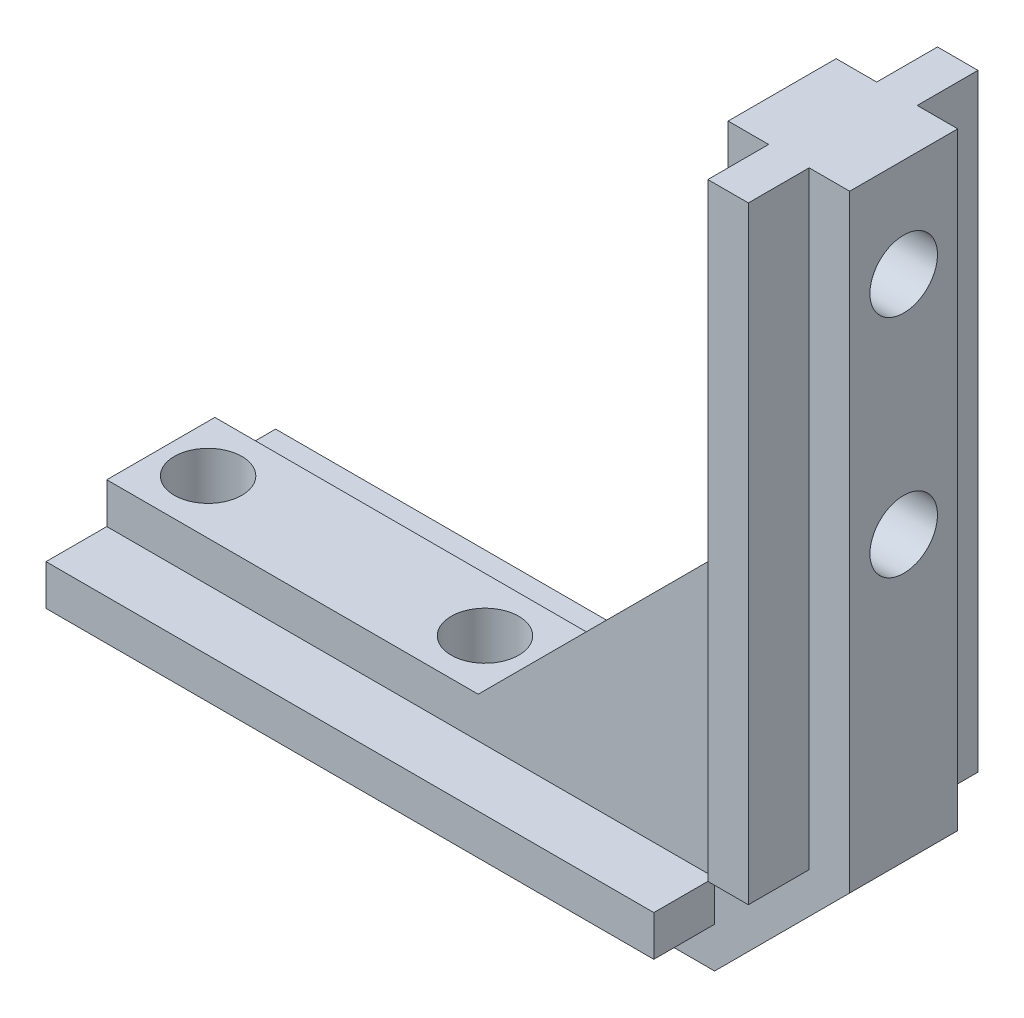
ISO-10303-21;
HEADER;
FILE_DESCRIPTION(('STEP AP214'),'2;1');
FILE_NAME('part.step','',(''),(''),'','','');
FILE_SCHEMA(('AUTOMOTIVE_DESIGN { 1 0 10303 214 1 1 1 1 }'));
ENDSEC;
DATA;
#1=APPLICATION_CONTEXT('core data for automotive mechanical design processes');
#2=APPLICATION_PROTOCOL_DEFINITION('international standard','automotive_design',2000,#1);
#3=PRODUCT_CONTEXT('',#1,'mechanical');
#4=PRODUCT('Part','Part','',(#3));
#5=PRODUCT_RELATED_PRODUCT_CATEGORY('part','',(#4));
#6=PRODUCT_DEFINITION_FORMATION('','',#4);
#7=PRODUCT_DEFINITION_CONTEXT('part definition',#1,'design');
#8=PRODUCT_DEFINITION('design','',#6,#7);
#9=PRODUCT_DEFINITION_SHAPE('','',#8);
#10=(LENGTH_UNIT() NAMED_UNIT(*) SI_UNIT(.MILLI.,.METRE.));
#11=(NAMED_UNIT(*) PLANE_ANGLE_UNIT() SI_UNIT($,.RADIAN.));
#12=(NAMED_UNIT(*) SI_UNIT($,.STERADIAN.) SOLID_ANGLE_UNIT());
#13=UNCERTAINTY_MEASURE_WITH_UNIT(LENGTH_MEASURE(1.E-05),#10,'distance_accuracy_value','');
#14=(GEOMETRIC_REPRESENTATION_CONTEXT(3) GLOBAL_UNCERTAINTY_ASSIGNED_CONTEXT((#13)) GLOBAL_UNIT_ASSIGNED_CONTEXT((#10,
#11,#12)) REPRESENTATION_CONTEXT('',''));
#15=CARTESIAN_POINT('',(0.,0.,0.));
#16=DIRECTION('',(0.,0.,1.));
#17=DIRECTION('',(1.,0.,0.));
#18=AXIS2_PLACEMENT_3D('',#15,#16,#17);
#19=CARTESIAN_POINT('',(46.,55.,4.));
#20=DIRECTION('',(1.,0.,0.));
#21=DIRECTION('',(0.,1.,0.));
#22=AXIS2_PLACEMENT_3D('',#19,#20,#21);
#23=PLANE('',#22);
#24=CARTESIAN_POINT('',(46.,31.,0.));
#25=DIRECTION('',(-1.,0.,0.));
#26=DIRECTION('',(0.,0.,1.));
#27=AXIS2_PLACEMENT_3D('',#24,#25,#26);
#28=CIRCLE('',#27,2.49999999999999);
#29=CARTESIAN_POINT('',(46.,31.,2.49999999999999));
#30=VERTEX_POINT('',#29);
#31=EDGE_CURVE('E778',#30,#30,#28,.T.);
#32=ORIENTED_EDGE('',*,*,#31,.F.);
#33=EDGE_LOOP('',(#32));
#34=FACE_BOUND('',#33,.T.);
#35=DIRECTION('',(0.,-1.,0.));
#36=VECTOR('',#35,1.);
#37=CARTESIAN_POINT('',(46.,55.,-4.));
#38=LINE('',#37,#36);
#39=CARTESIAN_POINT('',(46.,55.,-4.));
#40=VERTEX_POINT('',#39);
#41=CARTESIAN_POINT('',(46.,27.5,-4.));
#42=VERTEX_POINT('',#41);
#43=EDGE_CURVE('E421',#40,#42,#38,.T.);
#44=ORIENTED_EDGE('',*,*,#43,.T.);
#45=DIRECTION('',(0.,0.,-1.));
#46=VECTOR('',#45,1.);
#47=CARTESIAN_POINT('',(46.,27.5,4.));
#48=LINE('',#47,#46);
#49=CARTESIAN_POINT('',(46.,27.5,4.));
#50=VERTEX_POINT('',#49);
#51=EDGE_CURVE('E436',#50,#42,#48,.T.);
#52=ORIENTED_EDGE('',*,*,#51,.F.);
#53=DIRECTION('',(0.,-1.,0.));
#54=VECTOR('',#53,1.);
#55=CARTESIAN_POINT('',(46.,55.,4.));
#56=LINE('',#55,#54);
#57=CARTESIAN_POINT('',(46.,55.,4.));
#58=VERTEX_POINT('',#57);
#59=EDGE_CURVE('E395',#58,#50,#56,.T.);
#60=ORIENTED_EDGE('',*,*,#59,.F.);
#61=DIRECTION('',(0.,0.,-1.));
#62=VECTOR('',#61,1.);
#63=CARTESIAN_POINT('',(46.,55.,4.));
#64=LINE('',#63,#62);
#65=EDGE_CURVE('E440',#58,#40,#64,.T.);
#66=ORIENTED_EDGE('',*,*,#65,.T.);
#67=EDGE_LOOP('',(#44,#52,#60,#66));
#68=FACE_BOUND('',#67,.T.);
#69=CARTESIAN_POINT('',(46.,47.69,0.));
#70=DIRECTION('',(-1.,0.,0.));
#71=DIRECTION('',(0.,0.,1.));
#72=AXIS2_PLACEMENT_3D('',#69,#70,#71);
#73=CIRCLE('',#72,2.49999999999999);
#74=CARTESIAN_POINT('',(46.,47.69,2.49999999999999));
#75=VERTEX_POINT('',#74);
#76=EDGE_CURVE('E771',#75,#75,#73,.T.);
#77=ORIENTED_EDGE('',*,*,#76,.F.);
#78=EDGE_LOOP('',(#77));
#79=FACE_BOUND('',#78,.T.);
#80=ADVANCED_FACE('F44',(#34,#68,#79),#23,.F.);
#81=CARTESIAN_POINT('',(0.,9.,4.));
#82=DIRECTION('',(1.,0.,0.));
#83=DIRECTION('',(0.,1.,0.));
#84=AXIS2_PLACEMENT_3D('',#81,#82,#83);
#85=PLANE('',#84);
#86=DIRECTION('',(0.,-1.,0.));
#87=VECTOR('',#86,1.);
#88=CARTESIAN_POINT('',(0.,9.,-4.));
#89=LINE('',#88,#87);
#90=CARTESIAN_POINT('',(0.,9.,-4.));
#91=VERTEX_POINT('',#90);
#92=CARTESIAN_POINT('',(0.,6.,-4.));
#93=VERTEX_POINT('',#92);
#94=EDGE_CURVE('E212',#91,#93,#89,.T.);
#95=ORIENTED_EDGE('',*,*,#94,.T.);
#96=DIRECTION('',(0.,0.,1.));
#97=VECTOR('',#96,1.);
#98=CARTESIAN_POINT('',(0.,6.,-8.5));
#99=LINE('',#98,#97);
#100=CARTESIAN_POINT('',(0.,6.,-8.5));
#101=VERTEX_POINT('',#100);
#102=EDGE_CURVE('E207',#101,#93,#99,.T.);
#103=ORIENTED_EDGE('',*,*,#102,.F.);
#104=DIRECTION('',(0.,-1.,0.));
#105=VECTOR('',#104,1.);
#106=CARTESIAN_POINT('',(0.,0.,-8.5));
#107=LINE('',#106,#105);
#108=CARTESIAN_POINT('',(0.,3.,-8.5));
#109=VERTEX_POINT('',#108);
#110=EDGE_CURVE('E209',#101,#109,#107,.T.);
#111=ORIENTED_EDGE('',*,*,#110,.T.);
#112=DIRECTION('',(0.,0.,1.));
#113=VECTOR('',#112,1.);
#114=CARTESIAN_POINT('',(0.,3.,-8.5));
#115=LINE('',#114,#113);
#116=CARTESIAN_POINT('',(0.,3.,-4.));
#117=VERTEX_POINT('',#116);
#118=EDGE_CURVE('E215',#109,#117,#115,.T.);
#119=ORIENTED_EDGE('',*,*,#118,.T.);
#120=CARTESIAN_POINT('',(0.,0.,-4.));
#121=VERTEX_POINT('',#120);
#122=EDGE_CURVE('E338',#117,#121,#89,.T.);
#123=ORIENTED_EDGE('',*,*,#122,.T.);
#124=DIRECTION('',(0.,0.,-1.));
#125=VECTOR('',#124,1.);
#126=CARTESIAN_POINT('',(0.,0.,4.));
#127=LINE('',#126,#125);
#128=CARTESIAN_POINT('',(0.,0.,4.));
#129=VERTEX_POINT('',#128);
#130=EDGE_CURVE('E11',#129,#121,#127,.T.);
#131=ORIENTED_EDGE('',*,*,#130,.F.);
#132=DIRECTION('',(0.,-1.,0.));
#133=VECTOR('',#132,1.);
#134=CARTESIAN_POINT('',(0.,9.,4.));
#135=LINE('',#134,#133);
#136=CARTESIAN_POINT('',(0.,3.,4.));
#137=VERTEX_POINT('',#136);
#138=EDGE_CURVE('E382',#137,#129,#135,.T.);
#139=ORIENTED_EDGE('',*,*,#138,.F.);
#140=DIRECTION('',(0.,0.,-1.));
#141=VECTOR('',#140,1.);
#142=CARTESIAN_POINT('',(0.,3.,8.5));
#143=LINE('',#142,#141);
#144=CARTESIAN_POINT('',(0.,3.,8.5));
#145=VERTEX_POINT('',#144);
#146=EDGE_CURVE('E334',#145,#137,#143,.T.);
#147=ORIENTED_EDGE('',*,*,#146,.F.);
#148=DIRECTION('',(0.,-1.,0.));
#149=VECTOR('',#148,1.);
#150=CARTESIAN_POINT('',(0.,6.,8.5));
#151=LINE('',#150,#149);
#152=CARTESIAN_POINT('',(0.,6.,8.5));
#153=VERTEX_POINT('',#152);
#154=EDGE_CURVE('E296',#153,#145,#151,.T.);
#155=ORIENTED_EDGE('',*,*,#154,.F.);
#156=DIRECTION('',(0.,0.,-1.));
#157=VECTOR('',#156,1.);
#158=CARTESIAN_POINT('',(0.,6.,8.5));
#159=LINE('',#158,#157);
#160=CARTESIAN_POINT('',(0.,6.,4.));
#161=VERTEX_POINT('',#160);
#162=EDGE_CURVE('E310',#153,#161,#159,.T.);
#163=ORIENTED_EDGE('',*,*,#162,.T.);
#164=CARTESIAN_POINT('',(0.,9.,4.));
#165=VERTEX_POINT('',#164);
#166=EDGE_CURVE('E378',#165,#161,#135,.T.);
#167=ORIENTED_EDGE('',*,*,#166,.F.);
#168=DIRECTION('',(0.,0.,-1.));
#169=VECTOR('',#168,1.);
#170=CARTESIAN_POINT('',(0.,9.,4.));
#171=LINE('',#170,#169);
#172=EDGE_CURVE('E404',#165,#91,#171,.T.);
#173=ORIENTED_EDGE('',*,*,#172,.T.);
#174=EDGE_LOOP('',(#95,#103,#111,#119,#123,#131,#139,#147,#155,#163,#167,#173));
#175=FACE_BOUND('',#174,.T.);
#176=ADVANCED_FACE('F46',(#175),#85,.F.);
#177=CARTESIAN_POINT('',(0.,0.,4.));
#178=DIRECTION('',(0.,1.,0.));
#179=DIRECTION('',(0.,0.,1.));
#180=AXIS2_PLACEMENT_3D('',#177,#178,#179);
#181=PLANE('',#180);
#182=CARTESIAN_POINT('',(3.5,0.,0.));
#183=DIRECTION('',(0.,1.,0.));
#184=DIRECTION('',(0.,0.,1.));
#185=AXIS2_PLACEMENT_3D('',#182,#183,#184);
#186=CIRCLE('',#185,2.5);
#187=CARTESIAN_POINT('',(3.5,0.,2.5));
#188=VERTEX_POINT('',#187);
#189=EDGE_CURVE('E536',#188,#188,#186,.T.);
#190=ORIENTED_EDGE('',*,*,#189,.T.);
#191=EDGE_LOOP('',(#190));
#192=FACE_BOUND('',#191,.T.);
#193=CARTESIAN_POINT('',(24.0000000000001,0.,0.));
#194=DIRECTION('',(0.,1.,0.));
#195=DIRECTION('',(0.,0.,1.));
#196=AXIS2_PLACEMENT_3D('',#193,#194,#195);
#197=CIRCLE('',#196,2.5);
#198=CARTESIAN_POINT('',(24.0000000000001,0.,2.5));
#199=VERTEX_POINT('',#198);
#200=EDGE_CURVE('E539',#199,#199,#197,.T.);
#201=ORIENTED_EDGE('',*,*,#200,.T.);
#202=EDGE_LOOP('',(#201));
#203=FACE_BOUND('',#202,.T.);
#204=DIRECTION('',(1.,0.,0.));
#205=VECTOR('',#204,1.);
#206=CARTESIAN_POINT('',(0.,0.,-4.));
#207=LINE('',#206,#205);
#208=CARTESIAN_POINT('',(45.0000000000002,0.,-4.));
#209=VERTEX_POINT('',#208);
#210=EDGE_CURVE('E407',#121,#209,#207,.T.);
#211=ORIENTED_EDGE('',*,*,#210,.T.);
#212=DIRECTION('',(0.,0.,-1.));
#213=VECTOR('',#212,1.);
#214=CARTESIAN_POINT('',(45.0000000000002,0.,4.));
#215=LINE('',#214,#213);
#216=CARTESIAN_POINT('',(45.0000000000002,0.,4.));
#217=VERTEX_POINT('',#216);
#218=EDGE_CURVE('E53',#217,#209,#215,.T.);
#219=ORIENTED_EDGE('',*,*,#218,.F.);
#220=DIRECTION('',(1.,0.,0.));
#221=VECTOR('',#220,1.);
#222=CARTESIAN_POINT('',(0.,0.,4.));
#223=LINE('',#222,#221);
#224=EDGE_CURVE('E381',#129,#217,#223,.T.);
#225=ORIENTED_EDGE('',*,*,#224,.F.);
#226=ORIENTED_EDGE('',*,*,#130,.T.);
#227=EDGE_LOOP('',(#211,#219,#225,#226));
#228=FACE_BOUND('',#227,.T.);
#229=ADVANCED_FACE('F515',(#192,#203,#228),#181,.F.);
#230=CARTESIAN_POINT('',(55.,10.,4.));
#231=DIRECTION('',(-0.707106781186554,0.707106781186541,0.));
#232=DIRECTION('',(-0.707106781186541,-0.707106781186554,0.));
#233=AXIS2_PLACEMENT_3D('',#230,#231,#232);
#234=PLANE('',#233);
#235=DIRECTION('',(0.707106781186541,0.707106781186554,0.));
#236=VECTOR('',#235,1.);
#237=CARTESIAN_POINT('',(55.,10.,-4.));
#238=LINE('',#237,#236);
#239=CARTESIAN_POINT('',(55.,10.,-4.));
#240=VERTEX_POINT('',#239);
#241=EDGE_CURVE('E410',#209,#240,#238,.T.);
#242=ORIENTED_EDGE('',*,*,#241,.T.);
#243=DIRECTION('',(0.,0.,-1.));
#244=VECTOR('',#243,1.);
#245=CARTESIAN_POINT('',(55.,10.,4.));
#246=LINE('',#245,#244);
#247=CARTESIAN_POINT('',(55.,10.,4.));
#248=VERTEX_POINT('',#247);
#249=EDGE_CURVE('E448',#248,#240,#246,.T.);
#250=ORIENTED_EDGE('',*,*,#249,.F.);
#251=DIRECTION('',(0.707106781186541,0.707106781186554,0.));
#252=VECTOR('',#251,1.);
#253=CARTESIAN_POINT('',(55.,10.,4.));
#254=LINE('',#253,#252);
#255=EDGE_CURVE('E385',#217,#248,#254,.T.);
#256=ORIENTED_EDGE('',*,*,#255,.F.);
#257=ORIENTED_EDGE('',*,*,#218,.T.);
#258=EDGE_LOOP('',(#242,#250,#256,#257));
#259=FACE_BOUND('',#258,.T.);
#260=ADVANCED_FACE('F457',(#259),#234,.F.);
#261=CARTESIAN_POINT('',(55.,10.,4.));
#262=DIRECTION('',(-1.,0.,0.));
#263=DIRECTION('',(0.,-1.,0.));
#264=AXIS2_PLACEMENT_3D('',#261,#262,#263);
#265=PLANE('',#264);
#266=CARTESIAN_POINT('',(55.,47.69,0.));
#267=DIRECTION('',(-1.,0.,0.));
#268=DIRECTION('',(0.,0.,1.));
#269=AXIS2_PLACEMENT_3D('',#266,#267,#268);
#270=CIRCLE('',#269,2.5);
#271=CARTESIAN_POINT('',(55.,47.69,2.5));
#272=VERTEX_POINT('',#271);
#273=EDGE_CURVE('E775',#272,#272,#270,.T.);
#274=ORIENTED_EDGE('',*,*,#273,.T.);
#275=EDGE_LOOP('',(#274));
#276=FACE_BOUND('',#275,.T.);
#277=CARTESIAN_POINT('',(55.,31.,0.));
#278=DIRECTION('',(-1.,0.,0.));
#279=DIRECTION('',(0.,0.,1.));
#280=AXIS2_PLACEMENT_3D('',#277,#278,#279);
#281=CIRCLE('',#280,2.5);
#282=CARTESIAN_POINT('',(55.,31.,2.5));
#283=VERTEX_POINT('',#282);
#284=EDGE_CURVE('E239',#283,#283,#281,.T.);
#285=ORIENTED_EDGE('',*,*,#284,.T.);
#286=EDGE_LOOP('',(#285));
#287=FACE_BOUND('',#286,.T.);
#288=DIRECTION('',(0.,1.,0.));
#289=VECTOR('',#288,1.);
#290=CARTESIAN_POINT('',(55.,10.,-4.));
#291=LINE('',#290,#289);
#292=CARTESIAN_POINT('',(55.,55.,-4.));
#293=VERTEX_POINT('',#292);
#294=EDGE_CURVE('E413',#240,#293,#291,.T.);
#295=ORIENTED_EDGE('',*,*,#294,.T.);
#296=DIRECTION('',(0.,0.,-1.));
#297=VECTOR('',#296,1.);
#298=CARTESIAN_POINT('',(55.,55.,4.));
#299=LINE('',#298,#297);
#300=CARTESIAN_POINT('',(55.,55.,4.));
#301=VERTEX_POINT('',#300);
#302=EDGE_CURVE('E444',#301,#293,#299,.T.);
#303=ORIENTED_EDGE('',*,*,#302,.F.);
#304=DIRECTION('',(0.,1.,0.));
#305=VECTOR('',#304,1.);
#306=CARTESIAN_POINT('',(55.,10.,4.));
#307=LINE('',#306,#305);
#308=EDGE_CURVE('E388',#248,#301,#307,.T.);
#309=ORIENTED_EDGE('',*,*,#308,.F.);
#310=ORIENTED_EDGE('',*,*,#249,.T.);
#311=EDGE_LOOP('',(#295,#303,#309,#310));
#312=FACE_BOUND('',#311,.T.);
#313=ADVANCED_FACE('F469',(#276,#287,#312),#265,.F.);
#314=CARTESIAN_POINT('',(55.,55.,4.));
#315=DIRECTION('',(0.,-1.,0.));
#316=DIRECTION('',(0.,0.,-1.));
#317=AXIS2_PLACEMENT_3D('',#314,#315,#316);
#318=PLANE('',#317);
#319=DIRECTION('',(-1.,0.,0.));
#320=VECTOR('',#319,1.);
#321=CARTESIAN_POINT('',(55.,55.,-4.));
#322=LINE('',#321,#320);
#323=CARTESIAN_POINT('',(52.,55.,-4.));
#324=VERTEX_POINT('',#323);
#325=EDGE_CURVE('E417',#293,#324,#322,.T.);
#326=ORIENTED_EDGE('',*,*,#325,.T.);
#327=DIRECTION('',(0.,0.,1.));
#328=VECTOR('',#327,1.);
#329=CARTESIAN_POINT('',(52.,55.,-8.5));
#330=LINE('',#329,#328);
#331=CARTESIAN_POINT('',(52.,55.,-8.5));
#332=VERTEX_POINT('',#331);
#333=EDGE_CURVE('E68',#332,#324,#330,.T.);
#334=ORIENTED_EDGE('',*,*,#333,.F.);
#335=DIRECTION('',(-1.,0.,0.));
#336=VECTOR('',#335,1.);
#337=CARTESIAN_POINT('',(0.,55.,-8.5));
#338=LINE('',#337,#336);
#339=CARTESIAN_POINT('',(49.,55.,-8.5));
#340=VERTEX_POINT('',#339);
#341=EDGE_CURVE('E272',#332,#340,#338,.T.);
#342=ORIENTED_EDGE('',*,*,#341,.T.);
#343=DIRECTION('',(0.,0.,1.));
#344=VECTOR('',#343,1.);
#345=CARTESIAN_POINT('',(49.,55.,-8.5));
#346=LINE('',#345,#344);
#347=CARTESIAN_POINT('',(49.,55.,-4.));
#348=VERTEX_POINT('',#347);
#349=EDGE_CURVE('E248',#340,#348,#346,.T.);
#350=ORIENTED_EDGE('',*,*,#349,.T.);
#351=EDGE_CURVE('E416',#348,#40,#322,.T.);
#352=ORIENTED_EDGE('',*,*,#351,.T.);
#353=ORIENTED_EDGE('',*,*,#65,.F.);
#354=DIRECTION('',(-1.,0.,0.));
#355=VECTOR('',#354,1.);
#356=CARTESIAN_POINT('',(55.,55.,4.));
#357=LINE('',#356,#355);
#358=CARTESIAN_POINT('',(49.,55.,4.));
#359=VERTEX_POINT('',#358);
#360=EDGE_CURVE('E391',#359,#58,#357,.T.);
#361=ORIENTED_EDGE('',*,*,#360,.F.);
#362=DIRECTION('',(0.,0.,-1.));
#363=VECTOR('',#362,1.);
#364=CARTESIAN_POINT('',(49.,55.,8.5));
#365=LINE('',#364,#363);
#366=CARTESIAN_POINT('',(49.,55.,8.5));
#367=VERTEX_POINT('',#366);
#368=EDGE_CURVE('E350',#367,#359,#365,.T.);
#369=ORIENTED_EDGE('',*,*,#368,.F.);
#370=DIRECTION('',(-1.,0.,0.));
#371=VECTOR('',#370,1.);
#372=CARTESIAN_POINT('',(49.,55.,8.5));
#373=LINE('',#372,#371);
#374=CARTESIAN_POINT('',(52.,55.,8.5));
#375=VERTEX_POINT('',#374);
#376=EDGE_CURVE('E354',#375,#367,#373,.T.);
#377=ORIENTED_EDGE('',*,*,#376,.F.);
#378=DIRECTION('',(0.,0.,-1.));
#379=VECTOR('',#378,1.);
#380=CARTESIAN_POINT('',(52.,55.,8.5));
#381=LINE('',#380,#379);
#382=CARTESIAN_POINT('',(52.,55.,4.));
#383=VERTEX_POINT('',#382);
#384=EDGE_CURVE('E346',#375,#383,#381,.T.);
#385=ORIENTED_EDGE('',*,*,#384,.T.);
#386=EDGE_CURVE('E392',#301,#383,#357,.T.);
#387=ORIENTED_EDGE('',*,*,#386,.F.);
#388=ORIENTED_EDGE('',*,*,#302,.T.);
#389=EDGE_LOOP('',(#326,#334,#342,#350,#352,#353,#361,#369,#377,#385,#387,#388));
#390=FACE_BOUND('',#389,.T.);
#391=ADVANCED_FACE('F473',(#390),#318,.F.);
#392=CARTESIAN_POINT('',(46.,27.5,4.));
#393=DIRECTION('',(0.707106781186549,-0.707106781186546,0.));
#394=DIRECTION('',(0.707106781186546,0.707106781186549,0.));
#395=AXIS2_PLACEMENT_3D('',#392,#393,#394);
#396=PLANE('',#395);
#397=DIRECTION('',(-0.707106781186546,-0.707106781186549,0.));
#398=VECTOR('',#397,1.);
#399=CARTESIAN_POINT('',(46.,27.5,-4.));
#400=LINE('',#399,#398);
#401=CARTESIAN_POINT('',(27.5000000000001,9.,-4.));
#402=VERTEX_POINT('',#401);
#403=EDGE_CURVE('E424',#42,#402,#400,.T.);
#404=ORIENTED_EDGE('',*,*,#403,.T.);
#405=DIRECTION('',(0.,0.,-1.));
#406=VECTOR('',#405,1.);
#407=CARTESIAN_POINT('',(27.5000000000001,9.,4.));
#408=LINE('',#407,#406);
#409=CARTESIAN_POINT('',(27.5000000000001,9.,4.));
#410=VERTEX_POINT('',#409);
#411=EDGE_CURVE('E432',#410,#402,#408,.T.);
#412=ORIENTED_EDGE('',*,*,#411,.F.);
#413=DIRECTION('',(-0.707106781186546,-0.707106781186549,0.));
#414=VECTOR('',#413,1.);
#415=CARTESIAN_POINT('',(46.,27.5,4.));
#416=LINE('',#415,#414);
#417=EDGE_CURVE('E398',#50,#410,#416,.T.);
#418=ORIENTED_EDGE('',*,*,#417,.F.);
#419=ORIENTED_EDGE('',*,*,#51,.T.);
#420=EDGE_LOOP('',(#404,#412,#418,#419));
#421=FACE_BOUND('',#420,.T.);
#422=ADVANCED_FACE('F520',(#421),#396,.F.);
#423=CARTESIAN_POINT('',(27.5000000000001,9.,4.));
#424=DIRECTION('',(0.,-1.,0.));
#425=DIRECTION('',(1.,0.,0.));
#426=AXIS2_PLACEMENT_3D('',#423,#424,#425);
#427=PLANE('',#426);
#428=CARTESIAN_POINT('',(3.5,9.,0.));
#429=DIRECTION('',(0.,1.,0.));
#430=DIRECTION('',(0.,0.,1.));
#431=AXIS2_PLACEMENT_3D('',#428,#429,#430);
#432=CIRCLE('',#431,2.49999999999999);
#433=CARTESIAN_POINT('',(3.5,9.,2.49999999999999));
#434=VERTEX_POINT('',#433);
#435=EDGE_CURVE('E758',#434,#434,#432,.T.);
#436=ORIENTED_EDGE('',*,*,#435,.F.);
#437=EDGE_LOOP('',(#436));
#438=FACE_BOUND('',#437,.T.);
#439=CARTESIAN_POINT('',(24.0000000000001,9.,0.));
#440=DIRECTION('',(0.,1.,0.));
#441=DIRECTION('',(0.,0.,1.));
#442=AXIS2_PLACEMENT_3D('',#439,#440,#441);
#443=CIRCLE('',#442,2.49999999999999);
#444=CARTESIAN_POINT('',(24.0000000000001,9.,2.49999999999999));
#445=VERTEX_POINT('',#444);
#446=EDGE_CURVE('E763',#445,#445,#443,.T.);
#447=ORIENTED_EDGE('',*,*,#446,.F.);
#448=EDGE_LOOP('',(#447));
#449=FACE_BOUND('',#448,.T.);
#450=DIRECTION('',(-1.,0.,0.));
#451=VECTOR('',#450,1.);
#452=CARTESIAN_POINT('',(27.5000000000001,9.,-4.));
#453=LINE('',#452,#451);
#454=EDGE_CURVE('E427',#402,#91,#453,.T.);
#455=ORIENTED_EDGE('',*,*,#454,.T.);
#456=ORIENTED_EDGE('',*,*,#172,.F.);
#457=DIRECTION('',(-1.,0.,0.));
#458=VECTOR('',#457,1.);
#459=CARTESIAN_POINT('',(27.5000000000001,9.,4.));
#460=LINE('',#459,#458);
#461=EDGE_CURVE('E401',#410,#165,#460,.T.);
#462=ORIENTED_EDGE('',*,*,#461,.F.);
#463=ORIENTED_EDGE('',*,*,#411,.T.);
#464=EDGE_LOOP('',(#455,#456,#462,#463));
#465=FACE_BOUND('',#464,.T.);
#466=ADVANCED_FACE('F564',(#438,#449,#465),#427,.F.);
#467=CARTESIAN_POINT('',(0.,0.,4.));
#468=DIRECTION('',(0.,0.,1.));
#469=DIRECTION('',(1.,0.,0.));
#470=AXIS2_PLACEMENT_3D('',#467,#468,#469);
#471=PLANE('',#470);
#472=DIRECTION('',(-1.,0.,0.));
#473=VECTOR('',#472,1.);
#474=CARTESIAN_POINT('',(0.,6.,4.));
#475=LINE('',#474,#473);
#476=CARTESIAN_POINT('',(45.0000000000002,6.00000000000001,4.));
#477=VERTEX_POINT('',#476);
#478=EDGE_CURVE('E301',#477,#161,#475,.T.);
#479=ORIENTED_EDGE('',*,*,#478,.F.);
#480=DIRECTION('',(0.,1.,0.));
#481=VECTOR('',#480,1.);
#482=CARTESIAN_POINT('',(45.0000000000002,6.00000000000001,4.));
#483=LINE('',#482,#481);
#484=CARTESIAN_POINT('',(45.0000000000002,3.,4.));
#485=VERTEX_POINT('',#484);
#486=EDGE_CURVE('E315',#485,#477,#483,.T.);
#487=ORIENTED_EDGE('',*,*,#486,.F.);
#488=DIRECTION('',(1.,0.,0.));
#489=VECTOR('',#488,1.);
#490=CARTESIAN_POINT('',(0.,3.,4.));
#491=LINE('',#490,#489);
#492=EDGE_CURVE('E311',#137,#485,#491,.T.);
#493=ORIENTED_EDGE('',*,*,#492,.F.);
#494=ORIENTED_EDGE('',*,*,#138,.T.);
#495=ORIENTED_EDGE('',*,*,#224,.T.);
#496=ORIENTED_EDGE('',*,*,#255,.T.);
#497=ORIENTED_EDGE('',*,*,#308,.T.);
#498=ORIENTED_EDGE('',*,*,#386,.T.);
#499=DIRECTION('',(0.,1.,0.));
#500=VECTOR('',#499,1.);
#501=CARTESIAN_POINT('',(52.,55.,4.));
#502=LINE('',#501,#500);
#503=CARTESIAN_POINT('',(52.,10.,4.));
#504=VERTEX_POINT('',#503);
#505=EDGE_CURVE('E355',#504,#383,#502,.T.);
#506=ORIENTED_EDGE('',*,*,#505,.F.);
#507=DIRECTION('',(1.,0.,0.));
#508=VECTOR('',#507,1.);
#509=CARTESIAN_POINT('',(49.,10.,4.));
#510=LINE('',#509,#508);
#511=CARTESIAN_POINT('',(49.,10.,4.));
#512=VERTEX_POINT('',#511);
#513=EDGE_CURVE('E359',#512,#504,#510,.T.);
#514=ORIENTED_EDGE('',*,*,#513,.F.);
#515=DIRECTION('',(0.,-1.,0.));
#516=VECTOR('',#515,1.);
#517=CARTESIAN_POINT('',(49.,55.,4.));
#518=LINE('',#517,#516);
#519=EDGE_CURVE('E316',#359,#512,#518,.T.);
#520=ORIENTED_EDGE('',*,*,#519,.F.);
#521=ORIENTED_EDGE('',*,*,#360,.T.);
#522=ORIENTED_EDGE('',*,*,#59,.T.);
#523=ORIENTED_EDGE('',*,*,#417,.T.);
#524=ORIENTED_EDGE('',*,*,#461,.T.);
#525=ORIENTED_EDGE('',*,*,#166,.T.);
#526=EDGE_LOOP('',(#479,#487,#493,#494,#495,#496,#497,#498,#506,#514,#520,#521,#522,#523,#524,#525));
#527=FACE_BOUND('',#526,.T.);
#528=ADVANCED_FACE('F477',(#527),#471,.T.);
#529=CARTESIAN_POINT('',(0.,0.,-4.));
#530=DIRECTION('',(0.,0.,1.));
#531=DIRECTION('',(1.,0.,0.));
#532=AXIS2_PLACEMENT_3D('',#529,#530,#531);
#533=PLANE('',#532);
#534=DIRECTION('',(0.,1.,0.));
#535=VECTOR('',#534,1.);
#536=CARTESIAN_POINT('',(45.0000000000002,0.,-4.));
#537=LINE('',#536,#535);
#538=CARTESIAN_POINT('',(45.0000000000002,3.,-4.));
#539=VERTEX_POINT('',#538);
#540=CARTESIAN_POINT('',(45.0000000000002,6.00000000000001,-4.));
#541=VERTEX_POINT('',#540);
#542=EDGE_CURVE('E232',#539,#541,#537,.T.);
#543=ORIENTED_EDGE('',*,*,#542,.T.);
#544=DIRECTION('',(-1.,0.,0.));
#545=VECTOR('',#544,1.);
#546=CARTESIAN_POINT('',(0.,6.,-4.));
#547=LINE('',#546,#545);
#548=EDGE_CURVE('E60',#541,#93,#547,.T.);
#549=ORIENTED_EDGE('',*,*,#548,.T.);
#550=ORIENTED_EDGE('',*,*,#94,.F.);
#551=ORIENTED_EDGE('',*,*,#454,.F.);
#552=ORIENTED_EDGE('',*,*,#403,.F.);
#553=ORIENTED_EDGE('',*,*,#43,.F.);
#554=ORIENTED_EDGE('',*,*,#351,.F.);
#555=DIRECTION('',(0.,-1.,0.));
#556=VECTOR('',#555,1.);
#557=CARTESIAN_POINT('',(49.,0.,-4.));
#558=LINE('',#557,#556);
#559=CARTESIAN_POINT('',(49.,10.,-4.));
#560=VERTEX_POINT('',#559);
#561=EDGE_CURVE('E277',#348,#560,#558,.T.);
#562=ORIENTED_EDGE('',*,*,#561,.T.);
#563=DIRECTION('',(1.,0.,0.));
#564=VECTOR('',#563,1.);
#565=CARTESIAN_POINT('',(0.,9.99999999999997,-4.));
#566=LINE('',#565,#564);
#567=CARTESIAN_POINT('',(52.,10.,-4.));
#568=VERTEX_POINT('',#567);
#569=EDGE_CURVE('E281',#560,#568,#566,.T.);
#570=ORIENTED_EDGE('',*,*,#569,.T.);
#571=DIRECTION('',(0.,1.,0.));
#572=VECTOR('',#571,1.);
#573=CARTESIAN_POINT('',(52.,0.,-4.));
#574=LINE('',#573,#572);
#575=EDGE_CURVE('E265',#568,#324,#574,.T.);
#576=ORIENTED_EDGE('',*,*,#575,.T.);
#577=ORIENTED_EDGE('',*,*,#325,.F.);
#578=ORIENTED_EDGE('',*,*,#294,.F.);
#579=ORIENTED_EDGE('',*,*,#241,.F.);
#580=ORIENTED_EDGE('',*,*,#210,.F.);
#581=ORIENTED_EDGE('',*,*,#122,.F.);
#582=DIRECTION('',(1.,0.,0.));
#583=VECTOR('',#582,1.);
#584=CARTESIAN_POINT('',(0.,3.,-4.));
#585=LINE('',#584,#583);
#586=EDGE_CURVE('E236',#117,#539,#585,.T.);
#587=ORIENTED_EDGE('',*,*,#586,.T.);
#588=EDGE_LOOP('',(#543,#549,#550,#551,#552,#553,#554,#562,#570,#576,#577,#578,#579,#580,#581,#587));
#589=FACE_BOUND('',#588,.T.);
#590=ADVANCED_FACE('F464',(#589),#533,.F.);
#591=CARTESIAN_POINT('',(49.,55.,8.5));
#592=DIRECTION('',(1.,0.,0.));
#593=DIRECTION('',(0.,1.,0.));
#594=AXIS2_PLACEMENT_3D('',#591,#592,#593);
#595=PLANE('',#594);
#596=ORIENTED_EDGE('',*,*,#519,.T.);
#597=DIRECTION('',(0.,0.,-1.));
#598=VECTOR('',#597,1.);
#599=CARTESIAN_POINT('',(49.,10.,8.5));
#600=LINE('',#599,#598);
#601=CARTESIAN_POINT('',(49.,10.,8.5));
#602=VERTEX_POINT('',#601);
#603=EDGE_CURVE('E254',#602,#512,#600,.T.);
#604=ORIENTED_EDGE('',*,*,#603,.F.);
#605=DIRECTION('',(0.,-1.,0.));
#606=VECTOR('',#605,1.);
#607=CARTESIAN_POINT('',(49.,55.,8.5));
#608=LINE('',#607,#606);
#609=EDGE_CURVE('E360',#367,#602,#608,.T.);
#610=ORIENTED_EDGE('',*,*,#609,.F.);
#611=ORIENTED_EDGE('',*,*,#368,.T.);
#612=EDGE_LOOP('',(#596,#604,#610,#611));
#613=FACE_BOUND('',#612,.T.);
#614=ADVANCED_FACE('F492',(#613),#595,.F.);
#615=CARTESIAN_POINT('',(49.,10.,8.5));
#616=DIRECTION('',(0.,1.,0.));
#617=DIRECTION('',(-1.,0.,0.));
#618=AXIS2_PLACEMENT_3D('',#615,#616,#617);
#619=PLANE('',#618);
#620=ORIENTED_EDGE('',*,*,#513,.T.);
#621=DIRECTION('',(0.,0.,-1.));
#622=VECTOR('',#621,1.);
#623=CARTESIAN_POINT('',(52.,10.,8.5));
#624=LINE('',#623,#622);
#625=CARTESIAN_POINT('',(52.,10.,8.5));
#626=VERTEX_POINT('',#625);
#627=EDGE_CURVE('E342',#626,#504,#624,.T.);
#628=ORIENTED_EDGE('',*,*,#627,.F.);
#629=DIRECTION('',(1.,0.,0.));
#630=VECTOR('',#629,1.);
#631=CARTESIAN_POINT('',(49.,10.,8.5));
#632=LINE('',#631,#630);
#633=EDGE_CURVE('E372',#602,#626,#632,.T.);
#634=ORIENTED_EDGE('',*,*,#633,.F.);
#635=ORIENTED_EDGE('',*,*,#603,.T.);
#636=EDGE_LOOP('',(#620,#628,#634,#635));
#637=FACE_BOUND('',#636,.T.);
#638=ADVANCED_FACE('F483',(#637),#619,.F.);
#639=CARTESIAN_POINT('',(52.,55.,8.5));
#640=DIRECTION('',(-1.,0.,0.));
#641=DIRECTION('',(0.,-1.,0.));
#642=AXIS2_PLACEMENT_3D('',#639,#640,#641);
#643=PLANE('',#642);
#644=ORIENTED_EDGE('',*,*,#505,.T.);
#645=ORIENTED_EDGE('',*,*,#384,.F.);
#646=DIRECTION('',(0.,1.,0.));
#647=VECTOR('',#646,1.);
#648=CARTESIAN_POINT('',(52.,55.,8.5));
#649=LINE('',#648,#647);
#650=EDGE_CURVE('E369',#626,#375,#649,.T.);
#651=ORIENTED_EDGE('',*,*,#650,.F.);
#652=ORIENTED_EDGE('',*,*,#627,.T.);
#653=EDGE_LOOP('',(#644,#645,#651,#652));
#654=FACE_BOUND('',#653,.T.);
#655=ADVANCED_FACE('F479',(#654),#643,.F.);
#656=CARTESIAN_POINT('',(0.,0.,8.5));
#657=DIRECTION('',(0.,0.,1.));
#658=DIRECTION('',(1.,0.,0.));
#659=AXIS2_PLACEMENT_3D('',#656,#657,#658);
#660=PLANE('',#659);
#661=ORIENTED_EDGE('',*,*,#609,.T.);
#662=ORIENTED_EDGE('',*,*,#633,.T.);
#663=ORIENTED_EDGE('',*,*,#650,.T.);
#664=ORIENTED_EDGE('',*,*,#376,.T.);
#665=EDGE_LOOP('',(#661,#662,#663,#664));
#666=FACE_BOUND('',#665,.T.);
#667=ADVANCED_FACE('F494',(#666),#660,.T.);
#668=CARTESIAN_POINT('',(0.,3.,8.5));
#669=DIRECTION('',(0.,1.,0.));
#670=DIRECTION('',(0.,0.,1.));
#671=AXIS2_PLACEMENT_3D('',#668,#669,#670);
#672=PLANE('',#671);
#673=ORIENTED_EDGE('',*,*,#492,.T.);
#674=DIRECTION('',(0.,0.,-1.));
#675=VECTOR('',#674,1.);
#676=CARTESIAN_POINT('',(45.0000000000002,3.,8.5));
#677=LINE('',#676,#675);
#678=CARTESIAN_POINT('',(45.0000000000002,3.,8.5));
#679=VERTEX_POINT('',#678);
#680=EDGE_CURVE('E330',#679,#485,#677,.T.);
#681=ORIENTED_EDGE('',*,*,#680,.F.);
#682=DIRECTION('',(1.,0.,0.));
#683=VECTOR('',#682,1.);
#684=CARTESIAN_POINT('',(0.,3.,8.5));
#685=LINE('',#684,#683);
#686=EDGE_CURVE('E300',#145,#679,#685,.T.);
#687=ORIENTED_EDGE('',*,*,#686,.F.);
#688=ORIENTED_EDGE('',*,*,#146,.T.);
#689=EDGE_LOOP('',(#673,#681,#687,#688));
#690=FACE_BOUND('',#689,.T.);
#691=ADVANCED_FACE('F496',(#690),#672,.F.);
#692=CARTESIAN_POINT('',(45.0000000000002,6.00000000000001,8.5));
#693=DIRECTION('',(-1.,0.,0.));
#694=DIRECTION('',(0.,0.,1.));
#695=AXIS2_PLACEMENT_3D('',#692,#693,#694);
#696=PLANE('',#695);
#697=ORIENTED_EDGE('',*,*,#486,.T.);
#698=DIRECTION('',(0.,0.,-1.));
#699=VECTOR('',#698,1.);
#700=CARTESIAN_POINT('',(45.0000000000002,6.00000000000001,8.5));
#701=LINE('',#700,#699);
#702=CARTESIAN_POINT('',(45.0000000000002,6.00000000000001,8.5));
#703=VERTEX_POINT('',#702);
#704=EDGE_CURVE('E326',#703,#477,#701,.T.);
#705=ORIENTED_EDGE('',*,*,#704,.F.);
#706=DIRECTION('',(0.,1.,0.));
#707=VECTOR('',#706,1.);
#708=CARTESIAN_POINT('',(45.0000000000002,6.00000000000001,8.5));
#709=LINE('',#708,#707);
#710=EDGE_CURVE('E304',#679,#703,#709,.T.);
#711=ORIENTED_EDGE('',*,*,#710,.F.);
#712=ORIENTED_EDGE('',*,*,#680,.T.);
#713=EDGE_LOOP('',(#697,#705,#711,#712));
#714=FACE_BOUND('',#713,.T.);
#715=ADVANCED_FACE('F502',(#714),#696,.F.);
#716=CARTESIAN_POINT('',(0.,6.,8.5));
#717=DIRECTION('',(0.,-1.,0.));
#718=DIRECTION('',(1.,0.,0.));
#719=AXIS2_PLACEMENT_3D('',#716,#717,#718);
#720=PLANE('',#719);
#721=ORIENTED_EDGE('',*,*,#478,.T.);
#722=ORIENTED_EDGE('',*,*,#162,.F.);
#723=DIRECTION('',(-1.,0.,0.));
#724=VECTOR('',#723,1.);
#725=CARTESIAN_POINT('',(0.,6.,8.5));
#726=LINE('',#725,#724);
#727=EDGE_CURVE('E307',#703,#153,#726,.T.);
#728=ORIENTED_EDGE('',*,*,#727,.F.);
#729=ORIENTED_EDGE('',*,*,#704,.T.);
#730=EDGE_LOOP('',(#721,#722,#728,#729));
#731=FACE_BOUND('',#730,.T.);
#732=ADVANCED_FACE('F558',(#731),#720,.F.);
#733=CARTESIAN_POINT('',(0.,0.,8.5));
#734=DIRECTION('',(0.,0.,1.));
#735=DIRECTION('',(1.,0.,0.));
#736=AXIS2_PLACEMENT_3D('',#733,#734,#735);
#737=PLANE('',#736);
#738=ORIENTED_EDGE('',*,*,#154,.T.);
#739=ORIENTED_EDGE('',*,*,#686,.T.);
#740=ORIENTED_EDGE('',*,*,#710,.T.);
#741=ORIENTED_EDGE('',*,*,#727,.T.);
#742=EDGE_LOOP('',(#738,#739,#740,#741));
#743=FACE_BOUND('',#742,.T.);
#744=ADVANCED_FACE('F553',(#743),#737,.T.);
#745=CARTESIAN_POINT('',(49.,0.,-8.5));
#746=DIRECTION('',(-1.,0.,0.));
#747=DIRECTION('',(0.,-1.,0.));
#748=AXIS2_PLACEMENT_3D('',#745,#746,#747);
#749=PLANE('',#748);
#750=ORIENTED_EDGE('',*,*,#561,.F.);
#751=ORIENTED_EDGE('',*,*,#349,.F.);
#752=DIRECTION('',(0.,-1.,0.));
#753=VECTOR('',#752,1.);
#754=CARTESIAN_POINT('',(49.,0.,-8.5));
#755=LINE('',#754,#753);
#756=CARTESIAN_POINT('',(49.,10.,-8.5));
#757=VERTEX_POINT('',#756);
#758=EDGE_CURVE('E260',#340,#757,#755,.T.);
#759=ORIENTED_EDGE('',*,*,#758,.T.);
#760=DIRECTION('',(0.,0.,1.));
#761=VECTOR('',#760,1.);
#762=CARTESIAN_POINT('',(49.,10.,-8.5));
#763=LINE('',#762,#761);
#764=EDGE_CURVE('E276',#757,#560,#763,.T.);
#765=ORIENTED_EDGE('',*,*,#764,.T.);
#766=EDGE_LOOP('',(#750,#751,#759,#765));
#767=FACE_BOUND('',#766,.T.);
#768=ADVANCED_FACE('F591',(#767),#749,.T.);
#769=CARTESIAN_POINT('',(52.,0.,-8.5));
#770=DIRECTION('',(1.,0.,0.));
#771=DIRECTION('',(0.,1.,0.));
#772=AXIS2_PLACEMENT_3D('',#769,#770,#771);
#773=PLANE('',#772);
#774=ORIENTED_EDGE('',*,*,#575,.F.);
#775=DIRECTION('',(0.,0.,1.));
#776=VECTOR('',#775,1.);
#777=CARTESIAN_POINT('',(52.,10.,-8.5));
#778=LINE('',#777,#776);
#779=CARTESIAN_POINT('',(52.,10.,-8.5));
#780=VERTEX_POINT('',#779);
#781=EDGE_CURVE('E291',#780,#568,#778,.T.);
#782=ORIENTED_EDGE('',*,*,#781,.F.);
#783=DIRECTION('',(0.,1.,0.));
#784=VECTOR('',#783,1.);
#785=CARTESIAN_POINT('',(52.,0.,-8.5));
#786=LINE('',#785,#784);
#787=EDGE_CURVE('E269',#780,#332,#786,.T.);
#788=ORIENTED_EDGE('',*,*,#787,.T.);
#789=ORIENTED_EDGE('',*,*,#333,.T.);
#790=EDGE_LOOP('',(#774,#782,#788,#789));
#791=FACE_BOUND('',#790,.T.);
#792=ADVANCED_FACE('F588',(#791),#773,.T.);
#793=CARTESIAN_POINT('',(0.,9.99999999999997,-8.5));
#794=DIRECTION('',(0.,-1.,0.));
#795=DIRECTION('',(1.,0.,0.));
#796=AXIS2_PLACEMENT_3D('',#793,#794,#795);
#797=PLANE('',#796);
#798=ORIENTED_EDGE('',*,*,#569,.F.);
#799=ORIENTED_EDGE('',*,*,#764,.F.);
#800=DIRECTION('',(1.,0.,0.));
#801=VECTOR('',#800,1.);
#802=CARTESIAN_POINT('',(0.,9.99999999999997,-8.5));
#803=LINE('',#802,#801);
#804=EDGE_CURVE('E264',#757,#780,#803,.T.);
#805=ORIENTED_EDGE('',*,*,#804,.T.);
#806=ORIENTED_EDGE('',*,*,#781,.T.);
#807=EDGE_LOOP('',(#798,#799,#805,#806));
#808=FACE_BOUND('',#807,.T.);
#809=ADVANCED_FACE('F586',(#808),#797,.T.);
#810=CARTESIAN_POINT('',(0.,0.,-8.5));
#811=DIRECTION('',(0.,0.,1.));
#812=DIRECTION('',(1.,0.,0.));
#813=AXIS2_PLACEMENT_3D('',#810,#811,#812);
#814=PLANE('',#813);
#815=ORIENTED_EDGE('',*,*,#758,.F.);
#816=ORIENTED_EDGE('',*,*,#341,.F.);
#817=ORIENTED_EDGE('',*,*,#787,.F.);
#818=ORIENTED_EDGE('',*,*,#804,.F.);
#819=EDGE_LOOP('',(#815,#816,#817,#818));
#820=FACE_BOUND('',#819,.T.);
#821=ADVANCED_FACE('F583',(#820),#814,.F.);
#822=CARTESIAN_POINT('',(0.,6.,-8.5));
#823=DIRECTION('',(0.,1.,0.));
#824=DIRECTION('',(-1.,0.,0.));
#825=AXIS2_PLACEMENT_3D('',#822,#823,#824);
#826=PLANE('',#825);
#827=ORIENTED_EDGE('',*,*,#548,.F.);
#828=DIRECTION('',(0.,0.,1.));
#829=VECTOR('',#828,1.);
#830=CARTESIAN_POINT('',(45.0000000000002,6.00000000000001,-8.5));
#831=LINE('',#830,#829);
#832=CARTESIAN_POINT('',(45.0000000000002,6.00000000000001,-8.5));
#833=VERTEX_POINT('',#832);
#834=EDGE_CURVE('E230',#833,#541,#831,.T.);
#835=ORIENTED_EDGE('',*,*,#834,.F.);
#836=DIRECTION('',(-1.,0.,0.));
#837=VECTOR('',#836,1.);
#838=CARTESIAN_POINT('',(0.,6.,-8.5));
#839=LINE('',#838,#837);
#840=EDGE_CURVE('E223',#833,#101,#839,.T.);
#841=ORIENTED_EDGE('',*,*,#840,.T.);
#842=ORIENTED_EDGE('',*,*,#102,.T.);
#843=EDGE_LOOP('',(#827,#835,#841,#842));
#844=FACE_BOUND('',#843,.T.);
#845=ADVANCED_FACE('F229',(#844),#826,.T.);
#846=CARTESIAN_POINT('',(45.0000000000002,0.,-8.5));
#847=DIRECTION('',(1.,0.,0.));
#848=DIRECTION('',(0.,0.,-1.));
#849=AXIS2_PLACEMENT_3D('',#846,#847,#848);
#850=PLANE('',#849);
#851=ORIENTED_EDGE('',*,*,#542,.F.);
#852=DIRECTION('',(0.,0.,1.));
#853=VECTOR('',#852,1.);
#854=CARTESIAN_POINT('',(45.0000000000002,3.,-8.5));
#855=LINE('',#854,#853);
#856=CARTESIAN_POINT('',(45.0000000000002,3.,-8.5));
#857=VERTEX_POINT('',#856);
#858=EDGE_CURVE('E255',#857,#539,#855,.T.);
#859=ORIENTED_EDGE('',*,*,#858,.F.);
#860=DIRECTION('',(0.,1.,0.));
#861=VECTOR('',#860,1.);
#862=CARTESIAN_POINT('',(45.0000000000002,0.,-8.5));
#863=LINE('',#862,#861);
#864=EDGE_CURVE('E216',#857,#833,#863,.T.);
#865=ORIENTED_EDGE('',*,*,#864,.T.);
#866=ORIENTED_EDGE('',*,*,#834,.T.);
#867=EDGE_LOOP('',(#851,#859,#865,#866));
#868=FACE_BOUND('',#867,.T.);
#869=ADVANCED_FACE('F569',(#868),#850,.T.);
#870=CARTESIAN_POINT('',(0.,3.,-8.5));
#871=DIRECTION('',(0.,-1.,0.));
#872=DIRECTION('',(0.,0.,-1.));
#873=AXIS2_PLACEMENT_3D('',#870,#871,#872);
#874=PLANE('',#873);
#875=ORIENTED_EDGE('',*,*,#586,.F.);
#876=ORIENTED_EDGE('',*,*,#118,.F.);
#877=DIRECTION('',(1.,0.,0.));
#878=VECTOR('',#877,1.);
#879=CARTESIAN_POINT('',(0.,3.,-8.5));
#880=LINE('',#879,#878);
#881=EDGE_CURVE('E226',#109,#857,#880,.T.);
#882=ORIENTED_EDGE('',*,*,#881,.T.);
#883=ORIENTED_EDGE('',*,*,#858,.T.);
#884=EDGE_LOOP('',(#875,#876,#882,#883));
#885=FACE_BOUND('',#884,.T.);
#886=ADVANCED_FACE('F571',(#885),#874,.T.);
#887=CARTESIAN_POINT('',(0.,0.,-8.5));
#888=DIRECTION('',(0.,0.,1.));
#889=DIRECTION('',(1.,0.,0.));
#890=AXIS2_PLACEMENT_3D('',#887,#888,#889);
#891=PLANE('',#890);
#892=ORIENTED_EDGE('',*,*,#840,.F.);
#893=ORIENTED_EDGE('',*,*,#864,.F.);
#894=ORIENTED_EDGE('',*,*,#881,.F.);
#895=ORIENTED_EDGE('',*,*,#110,.F.);
#896=EDGE_LOOP('',(#892,#893,#894,#895));
#897=FACE_BOUND('',#896,.T.);
#898=ADVANCED_FACE('F221',(#897),#891,.F.);
#899=CARTESIAN_POINT('',(46.,31.,0.));
#900=DIRECTION('',(-1.,0.,0.));
#901=DIRECTION('',(0.,0.,1.));
#902=AXIS2_PLACEMENT_3D('',#899,#900,#901);
#903=CYLINDRICAL_SURFACE('',#902,2.49999999999999);
#904=ORIENTED_EDGE('',*,*,#284,.F.);
#905=EDGE_LOOP('',(#904));
#906=FACE_BOUND('',#905,.T.);
#907=ORIENTED_EDGE('',*,*,#31,.T.);
#908=EDGE_LOOP('',(#907));
#909=FACE_BOUND('',#908,.T.);
#910=ADVANCED_FACE('F577',(#906,#909),#903,.F.);
#911=CARTESIAN_POINT('',(46.,47.69,0.));
#912=DIRECTION('',(-1.,0.,0.));
#913=DIRECTION('',(0.,0.,1.));
#914=AXIS2_PLACEMENT_3D('',#911,#912,#913);
#915=CYLINDRICAL_SURFACE('',#914,2.49999999999999);
#916=ORIENTED_EDGE('',*,*,#273,.F.);
#917=EDGE_LOOP('',(#916));
#918=FACE_BOUND('',#917,.T.);
#919=ORIENTED_EDGE('',*,*,#76,.T.);
#920=EDGE_LOOP('',(#919));
#921=FACE_BOUND('',#920,.T.);
#922=ADVANCED_FACE('F723',(#918,#921),#915,.F.);
#923=CARTESIAN_POINT('',(24.0000000000001,9.,0.));
#924=DIRECTION('',(0.,1.,0.));
#925=DIRECTION('',(0.,0.,1.));
#926=AXIS2_PLACEMENT_3D('',#923,#924,#925);
#927=CYLINDRICAL_SURFACE('',#926,2.49999999999999);
#928=ORIENTED_EDGE('',*,*,#200,.F.);
#929=EDGE_LOOP('',(#928));
#930=FACE_BOUND('',#929,.T.);
#931=ORIENTED_EDGE('',*,*,#446,.T.);
#932=EDGE_LOOP('',(#931));
#933=FACE_BOUND('',#932,.T.);
#934=ADVANCED_FACE('F732',(#930,#933),#927,.F.);
#935=CARTESIAN_POINT('',(3.5,9.,0.));
#936=DIRECTION('',(0.,1.,0.));
#937=DIRECTION('',(0.,0.,1.));
#938=AXIS2_PLACEMENT_3D('',#935,#936,#937);
#939=CYLINDRICAL_SURFACE('',#938,2.49999999999999);
#940=ORIENTED_EDGE('',*,*,#189,.F.);
#941=EDGE_LOOP('',(#940));
#942=FACE_BOUND('',#941,.T.);
#943=ORIENTED_EDGE('',*,*,#435,.T.);
#944=EDGE_LOOP('',(#943));
#945=FACE_BOUND('',#944,.T.);
#946=ADVANCED_FACE('F742',(#942,#945),#939,.F.);
#947=CLOSED_SHELL('',(#80,#176,#229,#260,#313,#391,#422,#466,#528,#590,#614,#638,#655,#667,#691,
#715,#732,#744,#768,#792,#809,#821,#845,#869,#886,#898,#910,#922,#934,#946));
#948=MANIFOLD_SOLID_BREP('B2',#947);
#949=ADVANCED_BREP_SHAPE_REPRESENTATION('',(#18,#948),#14);
#950=SHAPE_DEFINITION_REPRESENTATION(#9,#949);
ENDSEC;
END-ISO-10303-21;
